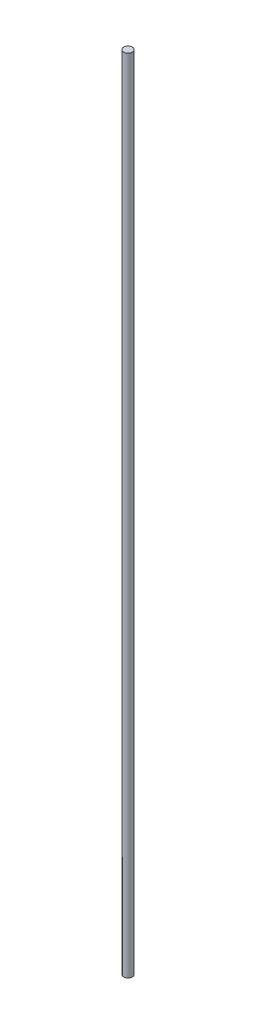
ISO-10303-21;
HEADER;
FILE_DESCRIPTION(('STEP AP214'),'2;1');
FILE_NAME('part.step','',(''),(''),'','','');
FILE_SCHEMA(('AUTOMOTIVE_DESIGN { 1 0 10303 214 1 1 1 1 }'));
ENDSEC;
DATA;
#1=APPLICATION_CONTEXT('core data for automotive mechanical design processes');
#2=APPLICATION_PROTOCOL_DEFINITION('international standard','automotive_design',2000,#1);
#3=PRODUCT_CONTEXT('',#1,'mechanical');
#4=PRODUCT('Part','Part','',(#3));
#5=PRODUCT_RELATED_PRODUCT_CATEGORY('part','',(#4));
#6=PRODUCT_DEFINITION_FORMATION('','',#4);
#7=PRODUCT_DEFINITION_CONTEXT('part definition',#1,'design');
#8=PRODUCT_DEFINITION('design','',#6,#7);
#9=PRODUCT_DEFINITION_SHAPE('','',#8);
#10=(LENGTH_UNIT() NAMED_UNIT(*) SI_UNIT(.MILLI.,.METRE.));
#11=(NAMED_UNIT(*) PLANE_ANGLE_UNIT() SI_UNIT($,.RADIAN.));
#12=(NAMED_UNIT(*) SI_UNIT($,.STERADIAN.) SOLID_ANGLE_UNIT());
#13=UNCERTAINTY_MEASURE_WITH_UNIT(LENGTH_MEASURE(1.E-05),#10,'distance_accuracy_value','');
#14=(GEOMETRIC_REPRESENTATION_CONTEXT(3) GLOBAL_UNCERTAINTY_ASSIGNED_CONTEXT((#13)) GLOBAL_UNIT_ASSIGNED_CONTEXT((#10,
#11,#12)) REPRESENTATION_CONTEXT('',''));
#15=CARTESIAN_POINT('',(0.,0.,0.));
#16=DIRECTION('',(0.,0.,1.));
#17=DIRECTION('',(1.,0.,0.));
#18=AXIS2_PLACEMENT_3D('',#15,#16,#17);
#19=CARTESIAN_POINT('',(0.,550.,0.));
#20=DIRECTION('',(0.,-1.,0.));
#21=DIRECTION('',(0.,0.,-1.));
#22=AXIS2_PLACEMENT_3D('',#19,#20,#21);
#23=CYLINDRICAL_SURFACE('',#22,3.);
#24=CARTESIAN_POINT('',(0.,550.,0.));
#25=DIRECTION('',(0.,1.,0.));
#26=DIRECTION('',(0.,0.,1.));
#27=AXIS2_PLACEMENT_3D('',#24,#25,#26);
#28=CIRCLE('',#27,3.);
#29=CARTESIAN_POINT('',(0.,550.,3.));
#30=VERTEX_POINT('',#29);
#31=EDGE_CURVE('E10',#30,#30,#28,.T.);
#32=ORIENTED_EDGE('',*,*,#31,.F.);
#33=EDGE_LOOP('',(#32));
#34=FACE_BOUND('',#33,.T.);
#35=CARTESIAN_POINT('',(0.,0.,0.));
#36=DIRECTION('',(0.,1.,0.));
#37=DIRECTION('',(0.,0.,1.));
#38=AXIS2_PLACEMENT_3D('',#35,#36,#37);
#39=CIRCLE('',#38,3.);
#40=CARTESIAN_POINT('',(0.,0.,3.));
#41=VERTEX_POINT('',#40);
#42=EDGE_CURVE('E48',#41,#41,#39,.T.);
#43=ORIENTED_EDGE('',*,*,#42,.T.);
#44=EDGE_LOOP('',(#43));
#45=FACE_BOUND('',#44,.T.);
#46=ADVANCED_FACE('F45',(#34,#45),#23,.T.);
#47=CARTESIAN_POINT('',(0.,550.,0.));
#48=DIRECTION('',(0.,1.,0.));
#49=DIRECTION('',(0.,0.,1.));
#50=AXIS2_PLACEMENT_3D('',#47,#48,#49);
#51=PLANE('',#50);
#52=ORIENTED_EDGE('',*,*,#31,.T.);
#53=EDGE_LOOP('',(#52));
#54=FACE_BOUND('',#53,.T.);
#55=ADVANCED_FACE('F60',(#54),#51,.T.);
#56=CARTESIAN_POINT('',(0.,0.,0.));
#57=DIRECTION('',(0.,1.,0.));
#58=DIRECTION('',(0.,0.,1.));
#59=AXIS2_PLACEMENT_3D('',#56,#57,#58);
#60=PLANE('',#59);
#61=ORIENTED_EDGE('',*,*,#42,.F.);
#62=EDGE_LOOP('',(#61));
#63=FACE_BOUND('',#62,.T.);
#64=ADVANCED_FACE('F58',(#63),#60,.F.);
#65=CLOSED_SHELL('',(#46,#55,#64));
#66=MANIFOLD_SOLID_BREP('B2',#65);
#67=ADVANCED_BREP_SHAPE_REPRESENTATION('',(#18,#66),#14);
#68=SHAPE_DEFINITION_REPRESENTATION(#9,#67);
ENDSEC;
END-ISO-10303-21;
